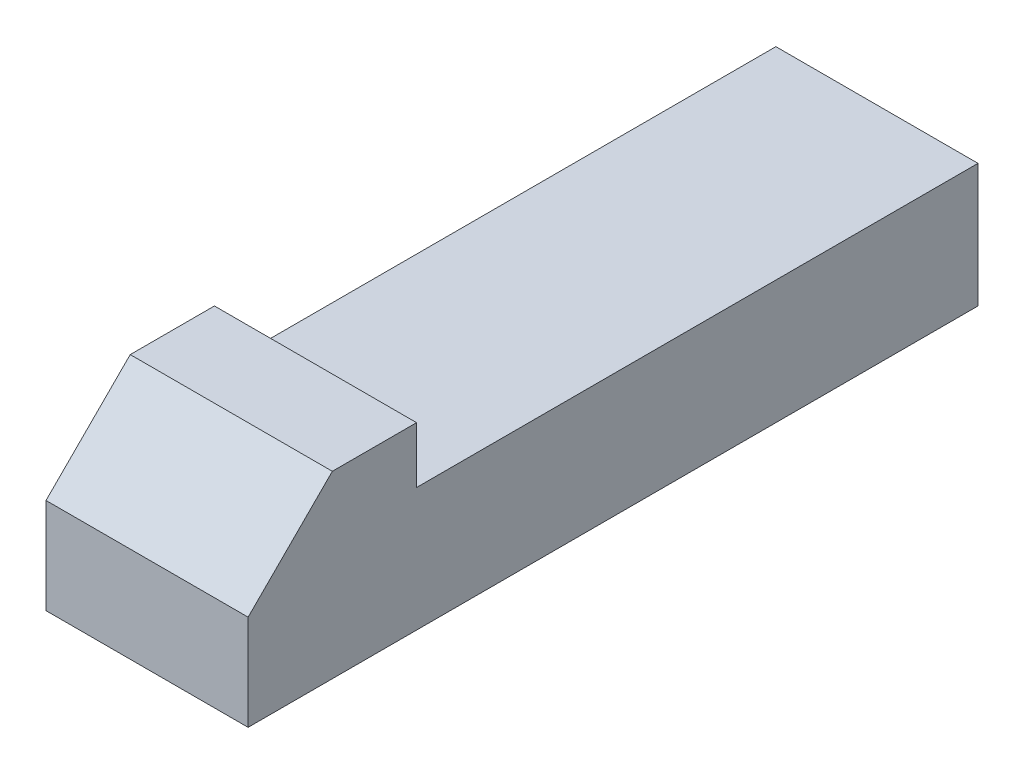
ISO-10303-21;
HEADER;
FILE_DESCRIPTION(('STEP AP214'),'2;1');
FILE_NAME('part.step','',(''),(''),'','','');
FILE_SCHEMA(('AUTOMOTIVE_DESIGN { 1 0 10303 214 1 1 1 1 }'));
ENDSEC;
DATA;
#1=APPLICATION_CONTEXT('core data for automotive mechanical design processes');
#2=APPLICATION_PROTOCOL_DEFINITION('international standard','automotive_design',2000,#1);
#3=PRODUCT_CONTEXT('',#1,'mechanical');
#4=PRODUCT('Part','Part','',(#3));
#5=PRODUCT_RELATED_PRODUCT_CATEGORY('part','',(#4));
#6=PRODUCT_DEFINITION_FORMATION('','',#4);
#7=PRODUCT_DEFINITION_CONTEXT('part definition',#1,'design');
#8=PRODUCT_DEFINITION('design','',#6,#7);
#9=PRODUCT_DEFINITION_SHAPE('','',#8);
#10=(LENGTH_UNIT() NAMED_UNIT(*) SI_UNIT(.MILLI.,.METRE.));
#11=(NAMED_UNIT(*) PLANE_ANGLE_UNIT() SI_UNIT($,.RADIAN.));
#12=(NAMED_UNIT(*) SI_UNIT($,.STERADIAN.) SOLID_ANGLE_UNIT());
#13=UNCERTAINTY_MEASURE_WITH_UNIT(LENGTH_MEASURE(1.E-05),#10,'distance_accuracy_value','');
#14=(GEOMETRIC_REPRESENTATION_CONTEXT(3) GLOBAL_UNCERTAINTY_ASSIGNED_CONTEXT((#13)) GLOBAL_UNIT_ASSIGNED_CONTEXT((#10,
#11,#12)) REPRESENTATION_CONTEXT('',''));
#15=CARTESIAN_POINT('',(0.,0.,0.));
#16=DIRECTION('',(0.,0.,1.));
#17=DIRECTION('',(1.,0.,0.));
#18=AXIS2_PLACEMENT_3D('',#15,#16,#17);
#19=CARTESIAN_POINT('',(9.,-5.5,-65.));
#20=DIRECTION('',(1.,0.,0.));
#21=DIRECTION('',(0.,0.,-1.));
#22=AXIS2_PLACEMENT_3D('',#19,#20,#21);
#23=PLANE('',#22);
#24=DIRECTION('',(0.,0.707106781186544,-0.707106781186551));
#25=VECTOR('',#24,1.);
#26=CARTESIAN_POINT('',(9.,10.5,-7.5));
#27=LINE('',#26,#25);
#28=CARTESIAN_POINT('',(9.,3.00000000000007,0.));
#29=VERTEX_POINT('',#28);
#30=CARTESIAN_POINT('',(9.,10.5,-7.5));
#31=VERTEX_POINT('',#30);
#32=EDGE_CURVE('E60',#29,#31,#27,.T.);
#33=ORIENTED_EDGE('',*,*,#32,.F.);
#34=DIRECTION('',(0.,1.,0.));
#35=VECTOR('',#34,1.);
#36=CARTESIAN_POINT('',(9.,-5.5,0.));
#37=LINE('',#36,#35);
#38=CARTESIAN_POINT('',(9.,-5.5,0.));
#39=VERTEX_POINT('',#38);
#40=EDGE_CURVE('E119',#39,#29,#37,.T.);
#41=ORIENTED_EDGE('',*,*,#40,.F.);
#42=DIRECTION('',(0.,0.,1.));
#43=VECTOR('',#42,1.);
#44=CARTESIAN_POINT('',(9.,-5.5,-65.));
#45=LINE('',#44,#43);
#46=CARTESIAN_POINT('',(9.,-5.5,-65.));
#47=VERTEX_POINT('',#46);
#48=EDGE_CURVE('E11',#47,#39,#45,.T.);
#49=ORIENTED_EDGE('',*,*,#48,.F.);
#50=DIRECTION('',(0.,1.,0.));
#51=VECTOR('',#50,1.);
#52=CARTESIAN_POINT('',(9.,-5.5,-65.));
#53=LINE('',#52,#51);
#54=CARTESIAN_POINT('',(9.,5.5,-65.));
#55=VERTEX_POINT('',#54);
#56=EDGE_CURVE('E131',#47,#55,#53,.T.);
#57=ORIENTED_EDGE('',*,*,#56,.T.);
#58=DIRECTION('',(0.,0.,1.));
#59=VECTOR('',#58,1.);
#60=CARTESIAN_POINT('',(9.,5.5,-65.));
#61=LINE('',#60,#59);
#62=CARTESIAN_POINT('',(9.,5.5,-15.));
#63=VERTEX_POINT('',#62);
#64=EDGE_CURVE('E46',#55,#63,#61,.T.);
#65=ORIENTED_EDGE('',*,*,#64,.T.);
#66=DIRECTION('',(0.,-1.,0.));
#67=VECTOR('',#66,1.);
#68=CARTESIAN_POINT('',(9.,10.5,-15.));
#69=LINE('',#68,#67);
#70=CARTESIAN_POINT('',(9.,10.5,-15.));
#71=VERTEX_POINT('',#70);
#72=EDGE_CURVE('E133',#71,#63,#69,.T.);
#73=ORIENTED_EDGE('',*,*,#72,.F.);
#74=DIRECTION('',(0.,0.,-1.));
#75=VECTOR('',#74,1.);
#76=CARTESIAN_POINT('',(9.,10.5,0.));
#77=LINE('',#76,#75);
#78=EDGE_CURVE('E175',#31,#71,#77,.T.);
#79=ORIENTED_EDGE('',*,*,#78,.F.);
#80=EDGE_LOOP('',(#33,#41,#49,#57,#65,#73,#79));
#81=FACE_BOUND('',#80,.T.);
#82=ADVANCED_FACE('F43',(#81),#23,.T.);
#83=CARTESIAN_POINT('',(-9.,-5.5,-65.));
#84=DIRECTION('',(0.,-1.,0.));
#85=DIRECTION('',(0.,0.,-1.));
#86=AXIS2_PLACEMENT_3D('',#83,#84,#85);
#87=PLANE('',#86);
#88=DIRECTION('',(1.,0.,0.));
#89=VECTOR('',#88,1.);
#90=CARTESIAN_POINT('',(-9.,-5.5,0.));
#91=LINE('',#90,#89);
#92=CARTESIAN_POINT('',(-9.,-5.5,0.));
#93=VERTEX_POINT('',#92);
#94=EDGE_CURVE('E126',#93,#39,#91,.T.);
#95=ORIENTED_EDGE('',*,*,#94,.F.);
#96=DIRECTION('',(0.,0.,1.));
#97=VECTOR('',#96,1.);
#98=CARTESIAN_POINT('',(-9.,-5.5,-65.));
#99=LINE('',#98,#97);
#100=CARTESIAN_POINT('',(-9.,-5.5,-65.));
#101=VERTEX_POINT('',#100);
#102=EDGE_CURVE('E52',#101,#93,#99,.T.);
#103=ORIENTED_EDGE('',*,*,#102,.F.);
#104=DIRECTION('',(1.,0.,0.));
#105=VECTOR('',#104,1.);
#106=CARTESIAN_POINT('',(-9.,-5.5,-65.));
#107=LINE('',#106,#105);
#108=EDGE_CURVE('E143',#101,#47,#107,.T.);
#109=ORIENTED_EDGE('',*,*,#108,.T.);
#110=ORIENTED_EDGE('',*,*,#48,.T.);
#111=EDGE_LOOP('',(#95,#103,#109,#110));
#112=FACE_BOUND('',#111,.T.);
#113=ADVANCED_FACE('F214',(#112),#87,.T.);
#114=CARTESIAN_POINT('',(-9.,-5.5,-65.));
#115=DIRECTION('',(-1.,0.,0.));
#116=DIRECTION('',(0.,0.,1.));
#117=AXIS2_PLACEMENT_3D('',#114,#115,#116);
#118=PLANE('',#117);
#119=DIRECTION('',(0.,0.707106781186544,-0.707106781186551));
#120=VECTOR('',#119,1.);
#121=CARTESIAN_POINT('',(-9.,10.5,-7.5));
#122=LINE('',#121,#120);
#123=CARTESIAN_POINT('',(-9.,3.00000000000007,0.));
#124=VERTEX_POINT('',#123);
#125=CARTESIAN_POINT('',(-9.,10.5,-7.5));
#126=VERTEX_POINT('',#125);
#127=EDGE_CURVE('E101',#124,#126,#122,.T.);
#128=ORIENTED_EDGE('',*,*,#127,.T.);
#129=DIRECTION('',(0.,0.,1.));
#130=VECTOR('',#129,1.);
#131=CARTESIAN_POINT('',(-9.,10.5,0.));
#132=LINE('',#131,#130);
#133=CARTESIAN_POINT('',(-9.,10.5,-15.));
#134=VERTEX_POINT('',#133);
#135=EDGE_CURVE('E172',#134,#126,#132,.T.);
#136=ORIENTED_EDGE('',*,*,#135,.F.);
#137=DIRECTION('',(0.,-1.,0.));
#138=VECTOR('',#137,1.);
#139=CARTESIAN_POINT('',(-9.,10.5,-15.));
#140=LINE('',#139,#138);
#141=CARTESIAN_POINT('',(-9.,5.5,-15.));
#142=VERTEX_POINT('',#141);
#143=EDGE_CURVE('E165',#134,#142,#140,.T.);
#144=ORIENTED_EDGE('',*,*,#143,.T.);
#145=DIRECTION('',(0.,0.,1.));
#146=VECTOR('',#145,1.);
#147=CARTESIAN_POINT('',(-9.,5.5,-65.));
#148=LINE('',#147,#146);
#149=CARTESIAN_POINT('',(-9.,5.5,-65.));
#150=VERTEX_POINT('',#149);
#151=EDGE_CURVE('E138',#150,#142,#148,.T.);
#152=ORIENTED_EDGE('',*,*,#151,.F.);
#153=DIRECTION('',(0.,-1.,0.));
#154=VECTOR('',#153,1.);
#155=CARTESIAN_POINT('',(-9.,-5.5,-65.));
#156=LINE('',#155,#154);
#157=EDGE_CURVE('E151',#150,#101,#156,.T.);
#158=ORIENTED_EDGE('',*,*,#157,.T.);
#159=ORIENTED_EDGE('',*,*,#102,.T.);
#160=DIRECTION('',(0.,-1.,0.));
#161=VECTOR('',#160,1.);
#162=CARTESIAN_POINT('',(-9.,-5.5,0.));
#163=LINE('',#162,#161);
#164=EDGE_CURVE('E116',#124,#93,#163,.T.);
#165=ORIENTED_EDGE('',*,*,#164,.F.);
#166=EDGE_LOOP('',(#128,#136,#144,#152,#158,#159,#165));
#167=FACE_BOUND('',#166,.T.);
#168=ADVANCED_FACE('F122',(#167),#118,.T.);
#169=CARTESIAN_POINT('',(-9.,5.5,-65.));
#170=DIRECTION('',(0.,1.,0.));
#171=DIRECTION('',(0.,0.,1.));
#172=AXIS2_PLACEMENT_3D('',#169,#170,#171);
#173=PLANE('',#172);
#174=DIRECTION('',(-1.,0.,0.));
#175=VECTOR('',#174,1.);
#176=CARTESIAN_POINT('',(-9.,5.5,-15.));
#177=LINE('',#176,#175);
#178=EDGE_CURVE('E68',#63,#142,#177,.T.);
#179=ORIENTED_EDGE('',*,*,#178,.F.);
#180=ORIENTED_EDGE('',*,*,#64,.F.);
#181=DIRECTION('',(-1.,0.,0.));
#182=VECTOR('',#181,1.);
#183=CARTESIAN_POINT('',(-9.,5.5,-65.));
#184=LINE('',#183,#182);
#185=EDGE_CURVE('E156',#55,#150,#184,.T.);
#186=ORIENTED_EDGE('',*,*,#185,.T.);
#187=ORIENTED_EDGE('',*,*,#151,.T.);
#188=EDGE_LOOP('',(#179,#180,#186,#187));
#189=FACE_BOUND('',#188,.T.);
#190=ADVANCED_FACE('F206',(#189),#173,.T.);
#191=CARTESIAN_POINT('',(0.,0.,-65.));
#192=DIRECTION('',(0.,0.,-1.));
#193=DIRECTION('',(-1.,0.,0.));
#194=AXIS2_PLACEMENT_3D('',#191,#192,#193);
#195=PLANE('',#194);
#196=ORIENTED_EDGE('',*,*,#56,.F.);
#197=ORIENTED_EDGE('',*,*,#108,.F.);
#198=ORIENTED_EDGE('',*,*,#157,.F.);
#199=ORIENTED_EDGE('',*,*,#185,.F.);
#200=EDGE_LOOP('',(#196,#197,#198,#199));
#201=FACE_BOUND('',#200,.T.);
#202=ADVANCED_FACE('F205',(#201),#195,.T.);
#203=CARTESIAN_POINT('',(0.,0.,0.));
#204=DIRECTION('',(0.,0.,-1.));
#205=DIRECTION('',(-1.,0.,0.));
#206=AXIS2_PLACEMENT_3D('',#203,#204,#205);
#207=PLANE('',#206);
#208=ORIENTED_EDGE('',*,*,#40,.T.);
#209=DIRECTION('',(1.,0.,0.));
#210=VECTOR('',#209,1.);
#211=CARTESIAN_POINT('',(-9.,3.00000000000007,0.));
#212=LINE('',#211,#210);
#213=EDGE_CURVE('E104',#124,#29,#212,.T.);
#214=ORIENTED_EDGE('',*,*,#213,.F.);
#215=ORIENTED_EDGE('',*,*,#164,.T.);
#216=ORIENTED_EDGE('',*,*,#94,.T.);
#217=EDGE_LOOP('',(#208,#214,#215,#216));
#218=FACE_BOUND('',#217,.T.);
#219=ADVANCED_FACE('F114',(#218),#207,.F.);
#220=CARTESIAN_POINT('',(-9.,10.5,-15.));
#221=DIRECTION('',(0.,0.,1.));
#222=DIRECTION('',(1.,0.,0.));
#223=AXIS2_PLACEMENT_3D('',#220,#221,#222);
#224=PLANE('',#223);
#225=ORIENTED_EDGE('',*,*,#178,.T.);
#226=ORIENTED_EDGE('',*,*,#143,.F.);
#227=DIRECTION('',(-1.,0.,0.));
#228=VECTOR('',#227,1.);
#229=CARTESIAN_POINT('',(-9.,10.5,-15.));
#230=LINE('',#229,#228);
#231=EDGE_CURVE('E169',#71,#134,#230,.T.);
#232=ORIENTED_EDGE('',*,*,#231,.F.);
#233=ORIENTED_EDGE('',*,*,#72,.T.);
#234=EDGE_LOOP('',(#225,#226,#232,#233));
#235=FACE_BOUND('',#234,.T.);
#236=ADVANCED_FACE('F200',(#235),#224,.F.);
#237=CARTESIAN_POINT('',(0.,10.5,0.));
#238=DIRECTION('',(0.,-1.,0.));
#239=DIRECTION('',(0.,0.,-1.));
#240=AXIS2_PLACEMENT_3D('',#237,#238,#239);
#241=PLANE('',#240);
#242=ORIENTED_EDGE('',*,*,#135,.T.);
#243=DIRECTION('',(1.,0.,0.));
#244=VECTOR('',#243,1.);
#245=CARTESIAN_POINT('',(-9.,10.5,-7.5));
#246=LINE('',#245,#244);
#247=EDGE_CURVE('E105',#126,#31,#246,.T.);
#248=ORIENTED_EDGE('',*,*,#247,.T.);
#249=ORIENTED_EDGE('',*,*,#78,.T.);
#250=ORIENTED_EDGE('',*,*,#231,.T.);
#251=EDGE_LOOP('',(#242,#248,#249,#250));
#252=FACE_BOUND('',#251,.T.);
#253=ADVANCED_FACE('F196',(#252),#241,.F.);
#254=CARTESIAN_POINT('',(-9.,10.5,-7.5));
#255=DIRECTION('',(0.,-0.707106781186551,-0.707106781186544));
#256=DIRECTION('',(0.,0.707106781186544,-0.707106781186551));
#257=AXIS2_PLACEMENT_3D('',#254,#255,#256);
#258=PLANE('',#257);
#259=ORIENTED_EDGE('',*,*,#32,.T.);
#260=ORIENTED_EDGE('',*,*,#247,.F.);
#261=ORIENTED_EDGE('',*,*,#127,.F.);
#262=ORIENTED_EDGE('',*,*,#213,.T.);
#263=EDGE_LOOP('',(#259,#260,#261,#262));
#264=FACE_BOUND('',#263,.T.);
#265=ADVANCED_FACE('F103',(#264),#258,.F.);
#266=CLOSED_SHELL('',(#82,#113,#168,#190,#202,#219,#236,#253,#265));
#267=MANIFOLD_SOLID_BREP('B2',#266);
#268=ADVANCED_BREP_SHAPE_REPRESENTATION('',(#18,#267),#14);
#269=SHAPE_DEFINITION_REPRESENTATION(#9,#268);
ENDSEC;
END-ISO-10303-21;
